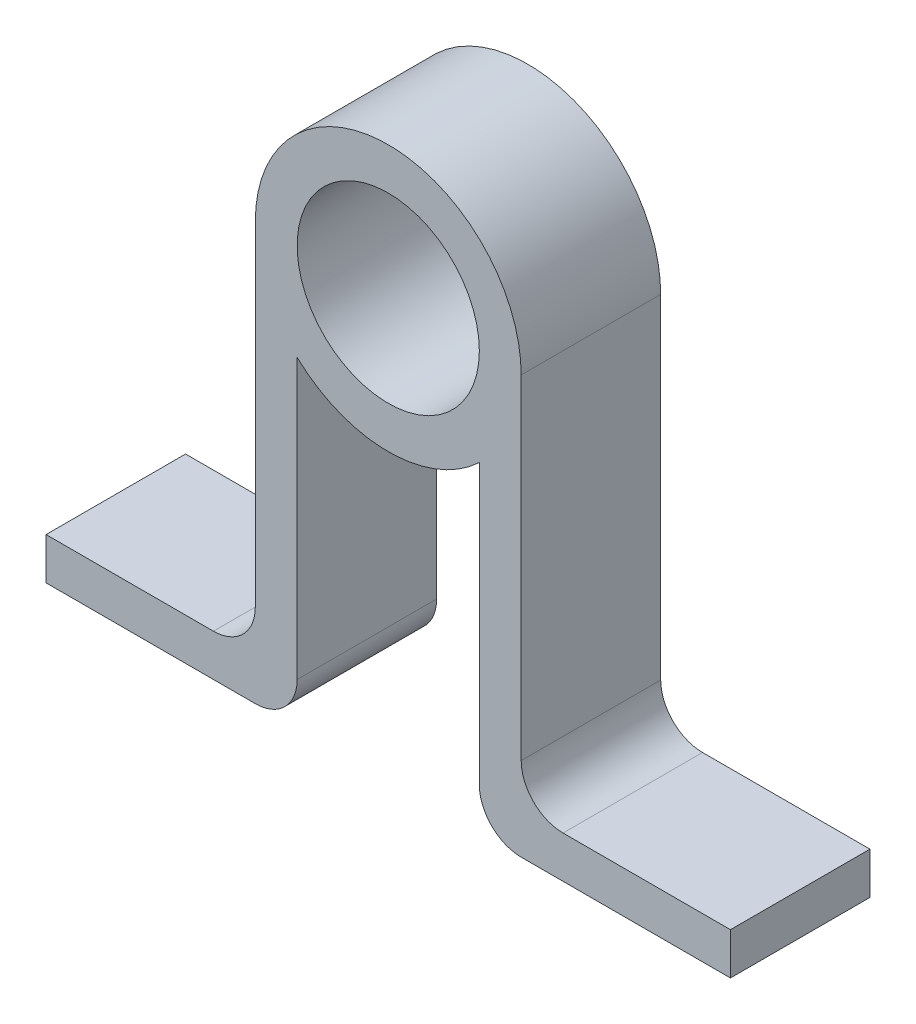
ISO-10303-21;
HEADER;
FILE_DESCRIPTION(('STEP AP214'),'2;1');
FILE_NAME('part.step','',(''),(''),'','','');
FILE_SCHEMA(('AUTOMOTIVE_DESIGN { 1 0 10303 214 1 1 1 1 }'));
ENDSEC;
DATA;
#1=APPLICATION_CONTEXT('core data for automotive mechanical design processes');
#2=APPLICATION_PROTOCOL_DEFINITION('international standard','automotive_design',2000,#1);
#3=PRODUCT_CONTEXT('',#1,'mechanical');
#4=PRODUCT('Part','Part','',(#3));
#5=PRODUCT_RELATED_PRODUCT_CATEGORY('part','',(#4));
#6=PRODUCT_DEFINITION_FORMATION('','',#4);
#7=PRODUCT_DEFINITION_CONTEXT('part definition',#1,'design');
#8=PRODUCT_DEFINITION('design','',#6,#7);
#9=PRODUCT_DEFINITION_SHAPE('','',#8);
#10=(LENGTH_UNIT() NAMED_UNIT(*) SI_UNIT(.MILLI.,.METRE.));
#11=(NAMED_UNIT(*) PLANE_ANGLE_UNIT() SI_UNIT($,.RADIAN.));
#12=(NAMED_UNIT(*) SI_UNIT($,.STERADIAN.) SOLID_ANGLE_UNIT());
#13=UNCERTAINTY_MEASURE_WITH_UNIT(LENGTH_MEASURE(1.E-05),#10,'distance_accuracy_value','');
#14=(GEOMETRIC_REPRESENTATION_CONTEXT(3) GLOBAL_UNCERTAINTY_ASSIGNED_CONTEXT((#13)) GLOBAL_UNIT_ASSIGNED_CONTEXT((#10,
#11,#12)) REPRESENTATION_CONTEXT('',''));
#15=CARTESIAN_POINT('',(0.,0.,0.));
#16=DIRECTION('',(0.,0.,1.));
#17=DIRECTION('',(1.,0.,0.));
#18=AXIS2_PLACEMENT_3D('',#15,#16,#17);
#19=CARTESIAN_POINT('',(0.,-29.94,10.));
#20=DIRECTION('',(0.,1.,0.));
#21=DIRECTION('',(0.,0.,1.));
#22=AXIS2_PLACEMENT_3D('',#19,#20,#21);
#23=PLANE('',#22);
#24=DIRECTION('',(1.,0.,0.));
#25=VECTOR('',#24,1.);
#26=CARTESIAN_POINT('',(0.,-29.94,0.));
#27=LINE('',#26,#25);
#28=CARTESIAN_POINT('',(-24.53,-29.94,0.));
#29=VERTEX_POINT('',#28);
#30=CARTESIAN_POINT('',(-9.53,-29.94,0.));
#31=VERTEX_POINT('',#30);
#32=EDGE_CURVE('E201',#29,#31,#27,.T.);
#33=ORIENTED_EDGE('',*,*,#32,.T.);
#34=DIRECTION('',(0.,0.,-1.));
#35=VECTOR('',#34,1.);
#36=CARTESIAN_POINT('',(-9.53,-29.94,10.));
#37=LINE('',#36,#35);
#38=CARTESIAN_POINT('',(-9.53,-29.94,10.));
#39=VERTEX_POINT('',#38);
#40=EDGE_CURVE('E11',#39,#31,#37,.T.);
#41=ORIENTED_EDGE('',*,*,#40,.F.);
#42=DIRECTION('',(1.,0.,0.));
#43=VECTOR('',#42,1.);
#44=CARTESIAN_POINT('',(0.,-29.94,10.));
#45=LINE('',#44,#43);
#46=CARTESIAN_POINT('',(-24.53,-29.94,10.));
#47=VERTEX_POINT('',#46);
#48=EDGE_CURVE('E259',#47,#39,#45,.T.);
#49=ORIENTED_EDGE('',*,*,#48,.F.);
#50=DIRECTION('',(0.,0.,-1.));
#51=VECTOR('',#50,1.);
#52=CARTESIAN_POINT('',(-24.53,-29.94,10.));
#53=LINE('',#52,#51);
#54=EDGE_CURVE('E205',#47,#29,#53,.T.);
#55=ORIENTED_EDGE('',*,*,#54,.T.);
#56=EDGE_LOOP('',(#33,#41,#49,#55));
#57=FACE_BOUND('',#56,.T.);
#58=ADVANCED_FACE('F50',(#57),#23,.F.);
#59=CARTESIAN_POINT('',(-9.53,-26.94,10.));
#60=DIRECTION('',(0.,0.,-1.));
#61=DIRECTION('',(-1.,0.,0.));
#62=AXIS2_PLACEMENT_3D('',#59,#60,#61);
#63=CYLINDRICAL_SURFACE('',#62,3.);
#64=CARTESIAN_POINT('',(-9.53,-26.94,0.));
#65=DIRECTION('',(0.,0.,1.));
#66=DIRECTION('',(1.,0.,0.));
#67=AXIS2_PLACEMENT_3D('',#64,#65,#66);
#68=CIRCLE('',#67,3.);
#69=CARTESIAN_POINT('',(-6.53,-26.94,0.));
#70=VERTEX_POINT('',#69);
#71=EDGE_CURVE('E210',#31,#70,#68,.T.);
#72=ORIENTED_EDGE('',*,*,#71,.T.);
#73=DIRECTION('',(0.,0.,-1.));
#74=VECTOR('',#73,1.);
#75=CARTESIAN_POINT('',(-6.53,-26.94,10.));
#76=LINE('',#75,#74);
#77=CARTESIAN_POINT('',(-6.53,-26.94,10.));
#78=VERTEX_POINT('',#77);
#79=EDGE_CURVE('E57',#78,#70,#76,.T.);
#80=ORIENTED_EDGE('',*,*,#79,.F.);
#81=CARTESIAN_POINT('',(-9.53,-26.94,10.));
#82=DIRECTION('',(0.,0.,1.));
#83=DIRECTION('',(1.,0.,0.));
#84=AXIS2_PLACEMENT_3D('',#81,#82,#83);
#85=CIRCLE('',#84,3.);
#86=EDGE_CURVE('E127',#39,#78,#85,.T.);
#87=ORIENTED_EDGE('',*,*,#86,.F.);
#88=ORIENTED_EDGE('',*,*,#40,.T.);
#89=EDGE_LOOP('',(#72,#80,#87,#88));
#90=FACE_BOUND('',#89,.T.);
#91=ADVANCED_FACE('F390',(#90),#63,.T.);
#92=CARTESIAN_POINT('',(-6.53,0.,10.));
#93=DIRECTION('',(-1.,0.,0.));
#94=DIRECTION('',(0.,-1.,0.));
#95=AXIS2_PLACEMENT_3D('',#92,#93,#94);
#96=PLANE('',#95);
#97=DIRECTION('',(0.,1.,0.));
#98=VECTOR('',#97,1.);
#99=CARTESIAN_POINT('',(-6.53,0.,0.));
#100=LINE('',#99,#98);
#101=CARTESIAN_POINT('',(-6.53,-6.94118145563131,0.));
#102=VERTEX_POINT('',#101);
#103=EDGE_CURVE('E206',#70,#102,#100,.T.);
#104=ORIENTED_EDGE('',*,*,#103,.T.);
#105=DIRECTION('',(0.,0.,-1.));
#106=VECTOR('',#105,1.);
#107=CARTESIAN_POINT('',(-6.53,-6.94118145563131,10.));
#108=LINE('',#107,#106);
#109=CARTESIAN_POINT('',(-6.53,-6.94118145563131,10.));
#110=VERTEX_POINT('',#109);
#111=EDGE_CURVE('E293',#110,#102,#108,.T.);
#112=ORIENTED_EDGE('',*,*,#111,.F.);
#113=DIRECTION('',(0.,1.,0.));
#114=VECTOR('',#113,1.);
#115=CARTESIAN_POINT('',(-6.53,0.,10.));
#116=LINE('',#115,#114);
#117=EDGE_CURVE('E304',#78,#110,#116,.T.);
#118=ORIENTED_EDGE('',*,*,#117,.F.);
#119=ORIENTED_EDGE('',*,*,#79,.T.);
#120=EDGE_LOOP('',(#104,#112,#118,#119));
#121=FACE_BOUND('',#120,.T.);
#122=ADVANCED_FACE('F301',(#121),#96,.F.);
#123=CARTESIAN_POINT('',(0.,0.,10.));
#124=DIRECTION('',(0.,0.,-1.));
#125=DIRECTION('',(-1.,0.,0.));
#126=AXIS2_PLACEMENT_3D('',#123,#124,#125);
#127=CYLINDRICAL_SURFACE('',#126,9.53);
#128=CARTESIAN_POINT('',(0.,0.,0.));
#129=DIRECTION('',(0.,0.,1.));
#130=DIRECTION('',(1.,0.,0.));
#131=AXIS2_PLACEMENT_3D('',#128,#129,#130);
#132=CIRCLE('',#131,9.53);
#133=CARTESIAN_POINT('',(6.53,-6.94118145563131,0.));
#134=VERTEX_POINT('',#133);
#135=EDGE_CURVE('E211',#102,#134,#132,.T.);
#136=ORIENTED_EDGE('',*,*,#135,.T.);
#137=DIRECTION('',(0.,0.,-1.));
#138=VECTOR('',#137,1.);
#139=CARTESIAN_POINT('',(6.53,-6.94118145563131,10.));
#140=LINE('',#139,#138);
#141=CARTESIAN_POINT('',(6.53,-6.94118145563131,10.));
#142=VERTEX_POINT('',#141);
#143=EDGE_CURVE('E295',#142,#134,#140,.T.);
#144=ORIENTED_EDGE('',*,*,#143,.F.);
#145=CARTESIAN_POINT('',(0.,0.,10.));
#146=DIRECTION('',(0.,0.,1.));
#147=DIRECTION('',(1.,0.,0.));
#148=AXIS2_PLACEMENT_3D('',#145,#146,#147);
#149=CIRCLE('',#148,9.53);
#150=EDGE_CURVE('E320',#110,#142,#149,.T.);
#151=ORIENTED_EDGE('',*,*,#150,.F.);
#152=ORIENTED_EDGE('',*,*,#111,.T.);
#153=EDGE_LOOP('',(#136,#144,#151,#152));
#154=FACE_BOUND('',#153,.T.);
#155=ADVANCED_FACE('F312',(#154),#127,.T.);
#156=CARTESIAN_POINT('',(6.53,0.,10.));
#157=DIRECTION('',(-1.,0.,0.));
#158=DIRECTION('',(0.,0.,1.));
#159=AXIS2_PLACEMENT_3D('',#156,#157,#158);
#160=PLANE('',#159);
#161=DIRECTION('',(0.,1.,0.));
#162=VECTOR('',#161,1.);
#163=CARTESIAN_POINT('',(6.53,0.,0.));
#164=LINE('',#163,#162);
#165=CARTESIAN_POINT('',(6.53,-26.94,0.));
#166=VERTEX_POINT('',#165);
#167=EDGE_CURVE('E220',#166,#134,#164,.T.);
#168=ORIENTED_EDGE('',*,*,#167,.F.);
#169=DIRECTION('',(0.,0.,-1.));
#170=VECTOR('',#169,1.);
#171=CARTESIAN_POINT('',(6.53,-26.94,10.));
#172=LINE('',#171,#170);
#173=CARTESIAN_POINT('',(6.53,-26.94,10.));
#174=VERTEX_POINT('',#173);
#175=EDGE_CURVE('E289',#174,#166,#172,.T.);
#176=ORIENTED_EDGE('',*,*,#175,.F.);
#177=DIRECTION('',(0.,1.,0.));
#178=VECTOR('',#177,1.);
#179=CARTESIAN_POINT('',(6.53,0.,10.));
#180=LINE('',#179,#178);
#181=EDGE_CURVE('E319',#174,#142,#180,.T.);
#182=ORIENTED_EDGE('',*,*,#181,.T.);
#183=ORIENTED_EDGE('',*,*,#143,.T.);
#184=EDGE_LOOP('',(#168,#176,#182,#183));
#185=FACE_BOUND('',#184,.T.);
#186=ADVANCED_FACE('F394',(#185),#160,.T.);
#187=CARTESIAN_POINT('',(9.53,-26.94,10.));
#188=DIRECTION('',(0.,0.,-1.));
#189=DIRECTION('',(-1.,0.,0.));
#190=AXIS2_PLACEMENT_3D('',#187,#188,#189);
#191=CYLINDRICAL_SURFACE('',#190,3.);
#192=CARTESIAN_POINT('',(9.53,-26.94,0.));
#193=DIRECTION('',(0.,0.,1.));
#194=DIRECTION('',(1.,0.,0.));
#195=AXIS2_PLACEMENT_3D('',#192,#193,#194);
#196=CIRCLE('',#195,3.);
#197=CARTESIAN_POINT('',(9.53,-29.94,0.));
#198=VERTEX_POINT('',#197);
#199=EDGE_CURVE('E225',#198,#166,#196,.F.);
#200=ORIENTED_EDGE('',*,*,#199,.F.);
#201=DIRECTION('',(0.,0.,-1.));
#202=VECTOR('',#201,1.);
#203=CARTESIAN_POINT('',(9.53,-29.94,10.));
#204=LINE('',#203,#202);
#205=CARTESIAN_POINT('',(9.53,-29.94,10.));
#206=VERTEX_POINT('',#205);
#207=EDGE_CURVE('E287',#206,#198,#204,.T.);
#208=ORIENTED_EDGE('',*,*,#207,.F.);
#209=CARTESIAN_POINT('',(9.53,-26.94,10.));
#210=DIRECTION('',(0.,0.,1.));
#211=DIRECTION('',(1.,0.,0.));
#212=AXIS2_PLACEMENT_3D('',#209,#210,#211);
#213=CIRCLE('',#212,3.);
#214=EDGE_CURVE('E323',#206,#174,#213,.F.);
#215=ORIENTED_EDGE('',*,*,#214,.T.);
#216=ORIENTED_EDGE('',*,*,#175,.T.);
#217=EDGE_LOOP('',(#200,#208,#215,#216));
#218=FACE_BOUND('',#217,.T.);
#219=ADVANCED_FACE('F356',(#218),#191,.T.);
#220=CARTESIAN_POINT('',(0.,-29.94,10.));
#221=DIRECTION('',(0.,-1.,0.));
#222=DIRECTION('',(1.,0.,0.));
#223=AXIS2_PLACEMENT_3D('',#220,#221,#222);
#224=PLANE('',#223);
#225=DIRECTION('',(-1.,0.,0.));
#226=VECTOR('',#225,1.);
#227=CARTESIAN_POINT('',(0.,-29.94,0.));
#228=LINE('',#227,#226);
#229=CARTESIAN_POINT('',(24.53,-29.94,0.));
#230=VERTEX_POINT('',#229);
#231=EDGE_CURVE('E226',#230,#198,#228,.T.);
#232=ORIENTED_EDGE('',*,*,#231,.F.);
#233=DIRECTION('',(0.,0.,-1.));
#234=VECTOR('',#233,1.);
#235=CARTESIAN_POINT('',(24.53,-29.94,10.));
#236=LINE('',#235,#234);
#237=CARTESIAN_POINT('',(24.53,-29.94,10.));
#238=VERTEX_POINT('',#237);
#239=EDGE_CURVE('E284',#238,#230,#236,.T.);
#240=ORIENTED_EDGE('',*,*,#239,.F.);
#241=DIRECTION('',(-1.,0.,0.));
#242=VECTOR('',#241,1.);
#243=CARTESIAN_POINT('',(0.,-29.94,10.));
#244=LINE('',#243,#242);
#245=EDGE_CURVE('E347',#238,#206,#244,.T.);
#246=ORIENTED_EDGE('',*,*,#245,.T.);
#247=ORIENTED_EDGE('',*,*,#207,.T.);
#248=EDGE_LOOP('',(#232,#240,#246,#247));
#249=FACE_BOUND('',#248,.T.);
#250=ADVANCED_FACE('F361',(#249),#224,.T.);
#251=CARTESIAN_POINT('',(24.53,0.,10.));
#252=DIRECTION('',(1.,0.,0.));
#253=DIRECTION('',(0.,0.,-1.));
#254=AXIS2_PLACEMENT_3D('',#251,#252,#253);
#255=PLANE('',#254);
#256=DIRECTION('',(0.,-1.,0.));
#257=VECTOR('',#256,1.);
#258=CARTESIAN_POINT('',(24.53,0.,0.));
#259=LINE('',#258,#257);
#260=CARTESIAN_POINT('',(24.53,-26.94,0.));
#261=VERTEX_POINT('',#260);
#262=EDGE_CURVE('E229',#261,#230,#259,.T.);
#263=ORIENTED_EDGE('',*,*,#262,.F.);
#264=DIRECTION('',(0.,0.,-1.));
#265=VECTOR('',#264,1.);
#266=CARTESIAN_POINT('',(24.53,-26.94,10.));
#267=LINE('',#266,#265);
#268=CARTESIAN_POINT('',(24.53,-26.94,10.));
#269=VERTEX_POINT('',#268);
#270=EDGE_CURVE('E279',#269,#261,#267,.T.);
#271=ORIENTED_EDGE('',*,*,#270,.F.);
#272=DIRECTION('',(0.,-1.,0.));
#273=VECTOR('',#272,1.);
#274=CARTESIAN_POINT('',(24.53,0.,10.));
#275=LINE('',#274,#273);
#276=EDGE_CURVE('E343',#269,#238,#275,.T.);
#277=ORIENTED_EDGE('',*,*,#276,.T.);
#278=ORIENTED_EDGE('',*,*,#239,.T.);
#279=EDGE_LOOP('',(#263,#271,#277,#278));
#280=FACE_BOUND('',#279,.T.);
#281=ADVANCED_FACE('F362',(#280),#255,.T.);
#282=CARTESIAN_POINT('',(0.,-26.94,10.));
#283=DIRECTION('',(0.,1.,0.));
#284=DIRECTION('',(-1.,0.,0.));
#285=AXIS2_PLACEMENT_3D('',#282,#283,#284);
#286=PLANE('',#285);
#287=DIRECTION('',(1.,0.,0.));
#288=VECTOR('',#287,1.);
#289=CARTESIAN_POINT('',(0.,-26.94,0.));
#290=LINE('',#289,#288);
#291=CARTESIAN_POINT('',(12.53,-26.94,0.));
#292=VERTEX_POINT('',#291);
#293=EDGE_CURVE('E233',#292,#261,#290,.T.);
#294=ORIENTED_EDGE('',*,*,#293,.F.);
#295=DIRECTION('',(0.,0.,-1.));
#296=VECTOR('',#295,1.);
#297=CARTESIAN_POINT('',(12.53,-26.94,10.));
#298=LINE('',#297,#296);
#299=CARTESIAN_POINT('',(12.53,-26.94,10.));
#300=VERTEX_POINT('',#299);
#301=EDGE_CURVE('E280',#300,#292,#298,.T.);
#302=ORIENTED_EDGE('',*,*,#301,.F.);
#303=DIRECTION('',(1.,0.,0.));
#304=VECTOR('',#303,1.);
#305=CARTESIAN_POINT('',(0.,-26.94,10.));
#306=LINE('',#305,#304);
#307=EDGE_CURVE('E340',#300,#269,#306,.T.);
#308=ORIENTED_EDGE('',*,*,#307,.T.);
#309=ORIENTED_EDGE('',*,*,#270,.T.);
#310=EDGE_LOOP('',(#294,#302,#308,#309));
#311=FACE_BOUND('',#310,.T.);
#312=ADVANCED_FACE('F367',(#311),#286,.T.);
#313=CARTESIAN_POINT('',(12.53,-23.94,10.));
#314=DIRECTION('',(0.,0.,-1.));
#315=DIRECTION('',(-1.,0.,0.));
#316=AXIS2_PLACEMENT_3D('',#313,#314,#315);
#317=CYLINDRICAL_SURFACE('',#316,3.);
#318=CARTESIAN_POINT('',(12.53,-23.94,0.));
#319=DIRECTION('',(0.,0.,1.));
#320=DIRECTION('',(1.,0.,0.));
#321=AXIS2_PLACEMENT_3D('',#318,#319,#320);
#322=CIRCLE('',#321,3.);
#323=CARTESIAN_POINT('',(9.53,-23.94,0.));
#324=VERTEX_POINT('',#323);
#325=EDGE_CURVE('E239',#292,#324,#322,.F.);
#326=ORIENTED_EDGE('',*,*,#325,.T.);
#327=DIRECTION('',(0.,0.,-1.));
#328=VECTOR('',#327,1.);
#329=CARTESIAN_POINT('',(9.53,-23.94,10.));
#330=LINE('',#329,#328);
#331=CARTESIAN_POINT('',(9.53,-23.94,10.));
#332=VERTEX_POINT('',#331);
#333=EDGE_CURVE('E272',#332,#324,#330,.T.);
#334=ORIENTED_EDGE('',*,*,#333,.F.);
#335=CARTESIAN_POINT('',(12.53,-23.94,10.));
#336=DIRECTION('',(0.,0.,1.));
#337=DIRECTION('',(1.,0.,0.));
#338=AXIS2_PLACEMENT_3D('',#335,#336,#337);
#339=CIRCLE('',#338,3.);
#340=EDGE_CURVE('E334',#300,#332,#339,.F.);
#341=ORIENTED_EDGE('',*,*,#340,.F.);
#342=ORIENTED_EDGE('',*,*,#301,.T.);
#343=EDGE_LOOP('',(#326,#334,#341,#342));
#344=FACE_BOUND('',#343,.T.);
#345=ADVANCED_FACE('F374',(#344),#317,.F.);
#346=CARTESIAN_POINT('',(9.53,0.,10.));
#347=DIRECTION('',(1.,0.,0.));
#348=DIRECTION('',(0.,1.,0.));
#349=AXIS2_PLACEMENT_3D('',#346,#347,#348);
#350=PLANE('',#349);
#351=DIRECTION('',(0.,-1.,0.));
#352=VECTOR('',#351,1.);
#353=CARTESIAN_POINT('',(9.53,0.,0.));
#354=LINE('',#353,#352);
#355=CARTESIAN_POINT('',(9.53,0.,0.));
#356=VERTEX_POINT('',#355);
#357=EDGE_CURVE('E245',#356,#324,#354,.T.);
#358=ORIENTED_EDGE('',*,*,#357,.F.);
#359=DIRECTION('',(0.,0.,-1.));
#360=VECTOR('',#359,1.);
#361=CARTESIAN_POINT('',(9.53,0.,10.));
#362=LINE('',#361,#360);
#363=CARTESIAN_POINT('',(9.53,0.,10.));
#364=VERTEX_POINT('',#363);
#365=EDGE_CURVE('E271',#364,#356,#362,.T.);
#366=ORIENTED_EDGE('',*,*,#365,.F.);
#367=DIRECTION('',(0.,-1.,0.));
#368=VECTOR('',#367,1.);
#369=CARTESIAN_POINT('',(9.53,0.,10.));
#370=LINE('',#369,#368);
#371=EDGE_CURVE('E329',#364,#332,#370,.T.);
#372=ORIENTED_EDGE('',*,*,#371,.T.);
#373=ORIENTED_EDGE('',*,*,#333,.T.);
#374=EDGE_LOOP('',(#358,#366,#372,#373));
#375=FACE_BOUND('',#374,.T.);
#376=ADVANCED_FACE('F373',(#375),#350,.T.);
#377=CARTESIAN_POINT('',(-9.53,0.,0.));
#378=VERTEX_POINT('',#377);
#379=EDGE_CURVE('E216',#356,#378,#132,.T.);
#380=ORIENTED_EDGE('',*,*,#379,.T.);
#381=DIRECTION('',(0.,0.,-1.));
#382=VECTOR('',#381,1.);
#383=CARTESIAN_POINT('',(-9.53,0.,10.));
#384=LINE('',#383,#382);
#385=CARTESIAN_POINT('',(-9.53,0.,10.));
#386=VERTEX_POINT('',#385);
#387=EDGE_CURVE('E270',#386,#378,#384,.T.);
#388=ORIENTED_EDGE('',*,*,#387,.F.);
#389=EDGE_CURVE('E195',#364,#386,#149,.T.);
#390=ORIENTED_EDGE('',*,*,#389,.F.);
#391=ORIENTED_EDGE('',*,*,#365,.T.);
#392=EDGE_LOOP('',(#380,#388,#390,#391));
#393=FACE_BOUND('',#392,.T.);
#394=ADVANCED_FACE('F411',(#393),#127,.T.);
#395=CARTESIAN_POINT('',(-9.53,0.,10.));
#396=DIRECTION('',(1.,0.,0.));
#397=DIRECTION('',(0.,1.,0.));
#398=AXIS2_PLACEMENT_3D('',#395,#396,#397);
#399=PLANE('',#398);
#400=DIRECTION('',(0.,-1.,0.));
#401=VECTOR('',#400,1.);
#402=CARTESIAN_POINT('',(-9.53,0.,0.));
#403=LINE('',#402,#401);
#404=CARTESIAN_POINT('',(-9.53,-23.94,0.));
#405=VERTEX_POINT('',#404);
#406=EDGE_CURVE('E247',#378,#405,#403,.T.);
#407=ORIENTED_EDGE('',*,*,#406,.T.);
#408=DIRECTION('',(0.,0.,-1.));
#409=VECTOR('',#408,1.);
#410=CARTESIAN_POINT('',(-9.53,-23.94,10.));
#411=LINE('',#410,#409);
#412=CARTESIAN_POINT('',(-9.53,-23.94,10.));
#413=VERTEX_POINT('',#412);
#414=EDGE_CURVE('E180',#413,#405,#411,.T.);
#415=ORIENTED_EDGE('',*,*,#414,.F.);
#416=DIRECTION('',(0.,-1.,0.));
#417=VECTOR('',#416,1.);
#418=CARTESIAN_POINT('',(-9.53,0.,10.));
#419=LINE('',#418,#417);
#420=EDGE_CURVE('E190',#386,#413,#419,.T.);
#421=ORIENTED_EDGE('',*,*,#420,.F.);
#422=ORIENTED_EDGE('',*,*,#387,.T.);
#423=EDGE_LOOP('',(#407,#415,#421,#422));
#424=FACE_BOUND('',#423,.T.);
#425=ADVANCED_FACE('F413',(#424),#399,.F.);
#426=CARTESIAN_POINT('',(-12.53,-23.94,10.));
#427=DIRECTION('',(0.,0.,-1.));
#428=DIRECTION('',(-1.,0.,0.));
#429=AXIS2_PLACEMENT_3D('',#426,#427,#428);
#430=CYLINDRICAL_SURFACE('',#429,3.);
#431=CARTESIAN_POINT('',(-12.53,-23.94,0.));
#432=DIRECTION('',(0.,0.,1.));
#433=DIRECTION('',(1.,0.,0.));
#434=AXIS2_PLACEMENT_3D('',#431,#432,#433);
#435=CIRCLE('',#434,3.);
#436=CARTESIAN_POINT('',(-12.53,-26.94,0.));
#437=VERTEX_POINT('',#436);
#438=EDGE_CURVE('E172',#437,#405,#435,.T.);
#439=ORIENTED_EDGE('',*,*,#438,.F.);
#440=DIRECTION('',(0.,0.,-1.));
#441=VECTOR('',#440,1.);
#442=CARTESIAN_POINT('',(-12.53,-26.94,10.));
#443=LINE('',#442,#441);
#444=CARTESIAN_POINT('',(-12.53,-26.94,10.));
#445=VERTEX_POINT('',#444);
#446=EDGE_CURVE('E170',#445,#437,#443,.T.);
#447=ORIENTED_EDGE('',*,*,#446,.F.);
#448=CARTESIAN_POINT('',(-12.53,-23.94,10.));
#449=DIRECTION('',(0.,0.,1.));
#450=DIRECTION('',(1.,0.,0.));
#451=AXIS2_PLACEMENT_3D('',#448,#449,#450);
#452=CIRCLE('',#451,3.);
#453=EDGE_CURVE('E171',#445,#413,#452,.T.);
#454=ORIENTED_EDGE('',*,*,#453,.T.);
#455=ORIENTED_EDGE('',*,*,#414,.T.);
#456=EDGE_LOOP('',(#439,#447,#454,#455));
#457=FACE_BOUND('',#456,.T.);
#458=ADVANCED_FACE('F173',(#457),#430,.F.);
#459=CARTESIAN_POINT('',(0.,-26.94,10.));
#460=DIRECTION('',(0.,-1.,0.));
#461=DIRECTION('',(0.,0.,-1.));
#462=AXIS2_PLACEMENT_3D('',#459,#460,#461);
#463=PLANE('',#462);
#464=DIRECTION('',(-1.,0.,0.));
#465=VECTOR('',#464,1.);
#466=CARTESIAN_POINT('',(0.,-26.94,0.));
#467=LINE('',#466,#465);
#468=CARTESIAN_POINT('',(-24.53,-26.94,0.));
#469=VERTEX_POINT('',#468);
#470=EDGE_CURVE('E117',#437,#469,#467,.T.);
#471=ORIENTED_EDGE('',*,*,#470,.T.);
#472=DIRECTION('',(0.,0.,-1.));
#473=VECTOR('',#472,1.);
#474=CARTESIAN_POINT('',(-24.53,-26.94,10.));
#475=LINE('',#474,#473);
#476=CARTESIAN_POINT('',(-24.53,-26.94,10.));
#477=VERTEX_POINT('',#476);
#478=EDGE_CURVE('E178',#477,#469,#475,.T.);
#479=ORIENTED_EDGE('',*,*,#478,.F.);
#480=DIRECTION('',(-1.,0.,0.));
#481=VECTOR('',#480,1.);
#482=CARTESIAN_POINT('',(0.,-26.94,10.));
#483=LINE('',#482,#481);
#484=EDGE_CURVE('E179',#445,#477,#483,.T.);
#485=ORIENTED_EDGE('',*,*,#484,.F.);
#486=ORIENTED_EDGE('',*,*,#446,.T.);
#487=EDGE_LOOP('',(#471,#479,#485,#486));
#488=FACE_BOUND('',#487,.T.);
#489=ADVANCED_FACE('F181',(#488),#463,.F.);
#490=CARTESIAN_POINT('',(-24.53,0.,10.));
#491=DIRECTION('',(1.,0.,0.));
#492=DIRECTION('',(0.,0.,-1.));
#493=AXIS2_PLACEMENT_3D('',#490,#491,#492);
#494=PLANE('',#493);
#495=DIRECTION('',(0.,-1.,0.));
#496=VECTOR('',#495,1.);
#497=CARTESIAN_POINT('',(-24.53,0.,0.));
#498=LINE('',#497,#496);
#499=EDGE_CURVE('E122',#469,#29,#498,.T.);
#500=ORIENTED_EDGE('',*,*,#499,.T.);
#501=ORIENTED_EDGE('',*,*,#54,.F.);
#502=DIRECTION('',(0.,-1.,0.));
#503=VECTOR('',#502,1.);
#504=CARTESIAN_POINT('',(-24.53,0.,10.));
#505=LINE('',#504,#503);
#506=EDGE_CURVE('E64',#477,#47,#505,.T.);
#507=ORIENTED_EDGE('',*,*,#506,.F.);
#508=ORIENTED_EDGE('',*,*,#478,.T.);
#509=EDGE_LOOP('',(#500,#501,#507,#508));
#510=FACE_BOUND('',#509,.T.);
#511=ADVANCED_FACE('F425',(#510),#494,.F.);
#512=CARTESIAN_POINT('',(0.,0.,10.));
#513=DIRECTION('',(0.,0.,-1.));
#514=DIRECTION('',(-1.,0.,0.));
#515=AXIS2_PLACEMENT_3D('',#512,#513,#514);
#516=CYLINDRICAL_SURFACE('',#515,6.53);
#517=CARTESIAN_POINT('',(0.,0.,10.));
#518=DIRECTION('',(0.,0.,1.));
#519=DIRECTION('',(1.,0.,0.));
#520=AXIS2_PLACEMENT_3D('',#517,#518,#519);
#521=CIRCLE('',#520,6.53);
#522=CARTESIAN_POINT('',(6.53,0.,10.));
#523=VERTEX_POINT('',#522);
#524=EDGE_CURVE('E198',#523,#523,#521,.T.);
#525=ORIENTED_EDGE('',*,*,#524,.T.);
#526=EDGE_LOOP('',(#525));
#527=FACE_BOUND('',#526,.T.);
#528=CARTESIAN_POINT('',(0.,0.,0.));
#529=DIRECTION('',(0.,0.,1.));
#530=DIRECTION('',(1.,0.,0.));
#531=AXIS2_PLACEMENT_3D('',#528,#529,#530);
#532=CIRCLE('',#531,6.53);
#533=CARTESIAN_POINT('',(6.53,0.,0.));
#534=VERTEX_POINT('',#533);
#535=EDGE_CURVE('E258',#534,#534,#532,.T.);
#536=ORIENTED_EDGE('',*,*,#535,.F.);
#537=EDGE_LOOP('',(#536));
#538=FACE_BOUND('',#537,.T.);
#539=ADVANCED_FACE('F421',(#527,#538),#516,.F.);
#540=CARTESIAN_POINT('',(0.,0.,10.));
#541=DIRECTION('',(0.,0.,1.));
#542=DIRECTION('',(1.,0.,0.));
#543=AXIS2_PLACEMENT_3D('',#540,#541,#542);
#544=PLANE('',#543);
#545=ORIENTED_EDGE('',*,*,#48,.T.);
#546=ORIENTED_EDGE('',*,*,#86,.T.);
#547=ORIENTED_EDGE('',*,*,#117,.T.);
#548=ORIENTED_EDGE('',*,*,#150,.T.);
#549=ORIENTED_EDGE('',*,*,#181,.F.);
#550=ORIENTED_EDGE('',*,*,#214,.F.);
#551=ORIENTED_EDGE('',*,*,#245,.F.);
#552=ORIENTED_EDGE('',*,*,#276,.F.);
#553=ORIENTED_EDGE('',*,*,#307,.F.);
#554=ORIENTED_EDGE('',*,*,#340,.T.);
#555=ORIENTED_EDGE('',*,*,#371,.F.);
#556=ORIENTED_EDGE('',*,*,#389,.T.);
#557=ORIENTED_EDGE('',*,*,#420,.T.);
#558=ORIENTED_EDGE('',*,*,#453,.F.);
#559=ORIENTED_EDGE('',*,*,#484,.T.);
#560=ORIENTED_EDGE('',*,*,#506,.T.);
#561=EDGE_LOOP('',(#545,#546,#547,#548,#549,#550,#551,#552,#553,#554,#555,#556,#557,#558,#559,#560));
#562=FACE_BOUND('',#561,.T.);
#563=ORIENTED_EDGE('',*,*,#524,.F.);
#564=EDGE_LOOP('',(#563));
#565=FACE_BOUND('',#564,.T.);
#566=ADVANCED_FACE('F182',(#562,#565),#544,.T.);
#567=CARTESIAN_POINT('',(0.,0.,0.));
#568=DIRECTION('',(0.,0.,1.));
#569=DIRECTION('',(1.,0.,0.));
#570=AXIS2_PLACEMENT_3D('',#567,#568,#569);
#571=PLANE('',#570);
#572=ORIENTED_EDGE('',*,*,#32,.F.);
#573=ORIENTED_EDGE('',*,*,#499,.F.);
#574=ORIENTED_EDGE('',*,*,#470,.F.);
#575=ORIENTED_EDGE('',*,*,#438,.T.);
#576=ORIENTED_EDGE('',*,*,#406,.F.);
#577=ORIENTED_EDGE('',*,*,#379,.F.);
#578=ORIENTED_EDGE('',*,*,#357,.T.);
#579=ORIENTED_EDGE('',*,*,#325,.F.);
#580=ORIENTED_EDGE('',*,*,#293,.T.);
#581=ORIENTED_EDGE('',*,*,#262,.T.);
#582=ORIENTED_EDGE('',*,*,#231,.T.);
#583=ORIENTED_EDGE('',*,*,#199,.T.);
#584=ORIENTED_EDGE('',*,*,#167,.T.);
#585=ORIENTED_EDGE('',*,*,#135,.F.);
#586=ORIENTED_EDGE('',*,*,#103,.F.);
#587=ORIENTED_EDGE('',*,*,#71,.F.);
#588=EDGE_LOOP('',(#572,#573,#574,#575,#576,#577,#578,#579,#580,#581,#582,#583,#584,#585,#586,#587));
#589=FACE_BOUND('',#588,.T.);
#590=ORIENTED_EDGE('',*,*,#535,.T.);
#591=EDGE_LOOP('',(#590));
#592=FACE_BOUND('',#591,.T.);
#593=ADVANCED_FACE('F309',(#589,#592),#571,.F.);
#594=CLOSED_SHELL('',(#58,#91,#122,#155,#186,#219,#250,#281,#312,#345,#376,#394,#425,#458,#489,
#511,#539,#566,#593));
#595=MANIFOLD_SOLID_BREP('B2',#594);
#596=ADVANCED_BREP_SHAPE_REPRESENTATION('',(#18,#595),#14);
#597=SHAPE_DEFINITION_REPRESENTATION(#9,#596);
ENDSEC;
END-ISO-10303-21;
